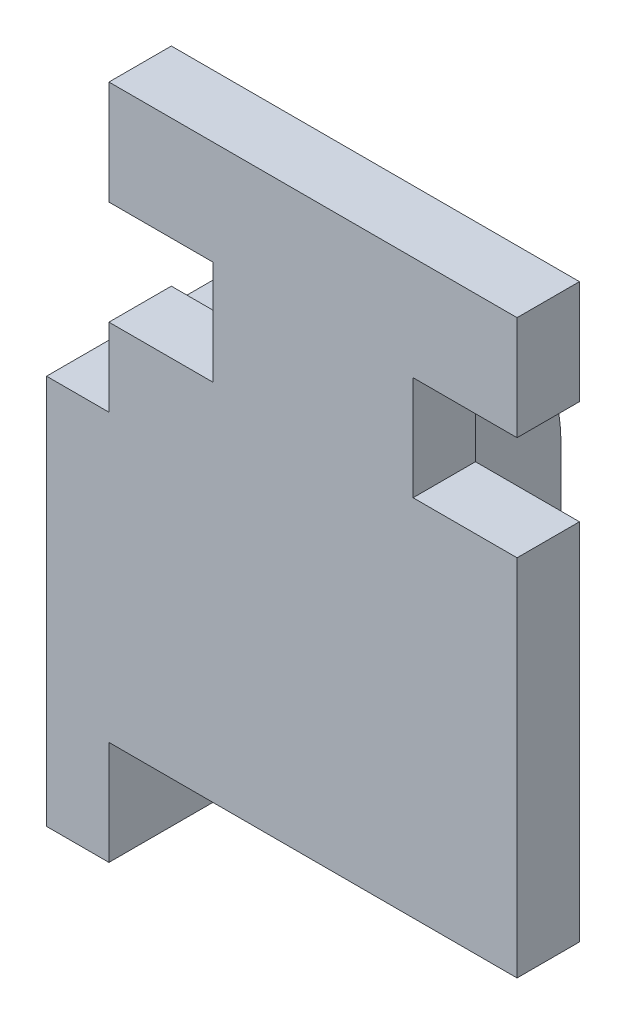
ISO-10303-21;
HEADER;
FILE_DESCRIPTION(('STEP AP214'),'2;1');
FILE_NAME('part.step','',(''),(''),'','','');
FILE_SCHEMA(('AUTOMOTIVE_DESIGN { 1 0 10303 214 1 1 1 1 }'));
ENDSEC;
DATA;
#1=APPLICATION_CONTEXT('core data for automotive mechanical design processes');
#2=APPLICATION_PROTOCOL_DEFINITION('international standard','automotive_design',2000,#1);
#3=PRODUCT_CONTEXT('',#1,'mechanical');
#4=PRODUCT('Part','Part','',(#3));
#5=PRODUCT_RELATED_PRODUCT_CATEGORY('part','',(#4));
#6=PRODUCT_DEFINITION_FORMATION('','',#4);
#7=PRODUCT_DEFINITION_CONTEXT('part definition',#1,'design');
#8=PRODUCT_DEFINITION('design','',#6,#7);
#9=PRODUCT_DEFINITION_SHAPE('','',#8);
#10=(LENGTH_UNIT() NAMED_UNIT(*) SI_UNIT(.MILLI.,.METRE.));
#11=(NAMED_UNIT(*) PLANE_ANGLE_UNIT() SI_UNIT($,.RADIAN.));
#12=(NAMED_UNIT(*) SI_UNIT($,.STERADIAN.) SOLID_ANGLE_UNIT());
#13=UNCERTAINTY_MEASURE_WITH_UNIT(LENGTH_MEASURE(1.E-05),#10,'distance_accuracy_value','');
#14=(GEOMETRIC_REPRESENTATION_CONTEXT(3) GLOBAL_UNCERTAINTY_ASSIGNED_CONTEXT((#13)) GLOBAL_UNIT_ASSIGNED_CONTEXT((#10,
#11,#12)) REPRESENTATION_CONTEXT('',''));
#15=CARTESIAN_POINT('',(0.,0.,0.));
#16=DIRECTION('',(0.,0.,1.));
#17=DIRECTION('',(1.,0.,0.));
#18=AXIS2_PLACEMENT_3D('',#15,#16,#17);
#19=CARTESIAN_POINT('',(0.,0.,0.24));
#20=DIRECTION('',(1.,0.,0.));
#21=DIRECTION('',(0.,0.,-1.));
#22=AXIS2_PLACEMENT_3D('',#19,#20,#21);
#23=PLANE('',#22);
#24=DIRECTION('',(0.,0.,-1.));
#25=VECTOR('',#24,1.);
#26=CARTESIAN_POINT('',(0.,1.1,-1.5));
#27=LINE('',#26,#25);
#28=CARTESIAN_POINT('',(0.,1.1,0.24));
#29=VERTEX_POINT('',#28);
#30=CARTESIAN_POINT('',(0.,1.1,0.));
#31=VERTEX_POINT('',#30);
#32=EDGE_CURVE('E335',#29,#31,#27,.T.);
#33=ORIENTED_EDGE('',*,*,#32,.F.);
#34=DIRECTION('',(0.,-1.,0.));
#35=VECTOR('',#34,1.);
#36=CARTESIAN_POINT('',(0.,0.,0.24));
#37=LINE('',#36,#35);
#38=CARTESIAN_POINT('',(0.,1.4,0.24));
#39=VERTEX_POINT('',#38);
#40=EDGE_CURVE('E185',#39,#29,#37,.T.);
#41=ORIENTED_EDGE('',*,*,#40,.F.);
#42=DIRECTION('',(0.,0.,-1.));
#43=VECTOR('',#42,1.);
#44=CARTESIAN_POINT('',(0.,1.4,0.24));
#45=LINE('',#44,#43);
#46=CARTESIAN_POINT('',(0.,1.4,0.));
#47=VERTEX_POINT('',#46);
#48=EDGE_CURVE('E273',#39,#47,#45,.T.);
#49=ORIENTED_EDGE('',*,*,#48,.T.);
#50=DIRECTION('',(0.,-1.,0.));
#51=VECTOR('',#50,1.);
#52=CARTESIAN_POINT('',(0.,0.,0.));
#53=LINE('',#52,#51);
#54=EDGE_CURVE('E204',#47,#31,#53,.T.);
#55=ORIENTED_EDGE('',*,*,#54,.T.);
#56=EDGE_LOOP('',(#33,#41,#49,#55));
#57=FACE_BOUND('',#56,.T.);
#58=ADVANCED_FACE('F39',(#57),#23,.F.);
#59=CARTESIAN_POINT('',(1.57,0.,0.24));
#60=DIRECTION('',(0.,1.,0.));
#61=DIRECTION('',(-1.,0.,0.));
#62=AXIS2_PLACEMENT_3D('',#59,#60,#61);
#63=PLANE('',#62);
#64=DIRECTION('',(1.,0.,0.));
#65=VECTOR('',#64,1.);
#66=CARTESIAN_POINT('',(1.57,0.,0.));
#67=LINE('',#66,#65);
#68=CARTESIAN_POINT('',(0.,0.,0.));
#69=VERTEX_POINT('',#68);
#70=CARTESIAN_POINT('',(1.57,0.,0.));
#71=VERTEX_POINT('',#70);
#72=EDGE_CURVE('E187',#69,#71,#67,.T.);
#73=ORIENTED_EDGE('',*,*,#72,.T.);
#74=DIRECTION('',(0.,0.,-1.));
#75=VECTOR('',#74,1.);
#76=CARTESIAN_POINT('',(1.57,0.,0.24));
#77=LINE('',#76,#75);
#78=CARTESIAN_POINT('',(1.57,0.,0.24));
#79=VERTEX_POINT('',#78);
#80=EDGE_CURVE('E313',#79,#71,#77,.T.);
#81=ORIENTED_EDGE('',*,*,#80,.F.);
#82=DIRECTION('',(1.,0.,0.));
#83=VECTOR('',#82,1.);
#84=CARTESIAN_POINT('',(1.57,0.,0.24));
#85=LINE('',#84,#83);
#86=CARTESIAN_POINT('',(0.,0.,0.24));
#87=VERTEX_POINT('',#86);
#88=EDGE_CURVE('E200',#87,#79,#85,.T.);
#89=ORIENTED_EDGE('',*,*,#88,.F.);
#90=DIRECTION('',(0.,0.,-1.));
#91=VECTOR('',#90,1.);
#92=CARTESIAN_POINT('',(0.,0.,0.24));
#93=LINE('',#92,#91);
#94=EDGE_CURVE('E235',#87,#69,#93,.T.);
#95=ORIENTED_EDGE('',*,*,#94,.T.);
#96=EDGE_LOOP('',(#73,#81,#89,#95));
#97=FACE_BOUND('',#96,.T.);
#98=ADVANCED_FACE('F385',(#97),#63,.F.);
#99=CARTESIAN_POINT('',(1.57,1.4,0.24));
#100=DIRECTION('',(-1.,0.,0.));
#101=DIRECTION('',(0.,0.,1.));
#102=AXIS2_PLACEMENT_3D('',#99,#100,#101);
#103=PLANE('',#102);
#104=DIRECTION('',(0.,1.,0.));
#105=VECTOR('',#104,1.);
#106=CARTESIAN_POINT('',(1.57,1.4,0.));
#107=LINE('',#106,#105);
#108=CARTESIAN_POINT('',(1.57,1.4,0.));
#109=VERTEX_POINT('',#108);
#110=EDGE_CURVE('E193',#71,#109,#107,.T.);
#111=ORIENTED_EDGE('',*,*,#110,.T.);
#112=DIRECTION('',(0.,0.,-1.));
#113=VECTOR('',#112,1.);
#114=CARTESIAN_POINT('',(1.57,1.4,0.24));
#115=LINE('',#114,#113);
#116=CARTESIAN_POINT('',(1.57,1.4,0.24));
#117=VERTEX_POINT('',#116);
#118=EDGE_CURVE('E309',#117,#109,#115,.T.);
#119=ORIENTED_EDGE('',*,*,#118,.F.);
#120=DIRECTION('',(0.,1.,0.));
#121=VECTOR('',#120,1.);
#122=CARTESIAN_POINT('',(1.57,1.4,0.24));
#123=LINE('',#122,#121);
#124=EDGE_CURVE('E203',#79,#117,#123,.T.);
#125=ORIENTED_EDGE('',*,*,#124,.F.);
#126=ORIENTED_EDGE('',*,*,#80,.T.);
#127=EDGE_LOOP('',(#111,#119,#125,#126));
#128=FACE_BOUND('',#127,.T.);
#129=ADVANCED_FACE('F382',(#128),#103,.F.);
#130=CARTESIAN_POINT('',(1.17,1.4,0.24));
#131=DIRECTION('',(0.,-1.,0.));
#132=DIRECTION('',(1.,0.,0.));
#133=AXIS2_PLACEMENT_3D('',#130,#131,#132);
#134=PLANE('',#133);
#135=DIRECTION('',(-1.,0.,0.));
#136=VECTOR('',#135,1.);
#137=CARTESIAN_POINT('',(1.17,1.4,0.));
#138=LINE('',#137,#136);
#139=CARTESIAN_POINT('',(1.17,1.4,0.));
#140=VERTEX_POINT('',#139);
#141=EDGE_CURVE('E239',#109,#140,#138,.T.);
#142=ORIENTED_EDGE('',*,*,#141,.T.);
#143=DIRECTION('',(0.,0.,-1.));
#144=VECTOR('',#143,1.);
#145=CARTESIAN_POINT('',(1.17,1.4,0.24));
#146=LINE('',#145,#144);
#147=CARTESIAN_POINT('',(1.17,1.4,0.24));
#148=VERTEX_POINT('',#147);
#149=EDGE_CURVE('E305',#148,#140,#146,.T.);
#150=ORIENTED_EDGE('',*,*,#149,.F.);
#151=DIRECTION('',(-1.,0.,0.));
#152=VECTOR('',#151,1.);
#153=CARTESIAN_POINT('',(1.17,1.4,0.24));
#154=LINE('',#153,#152);
#155=EDGE_CURVE('E207',#117,#148,#154,.T.);
#156=ORIENTED_EDGE('',*,*,#155,.F.);
#157=ORIENTED_EDGE('',*,*,#118,.T.);
#158=EDGE_LOOP('',(#142,#150,#156,#157));
#159=FACE_BOUND('',#158,.T.);
#160=ADVANCED_FACE('F379',(#159),#134,.F.);
#161=CARTESIAN_POINT('',(1.17,1.8,0.24));
#162=DIRECTION('',(-1.,0.,0.));
#163=DIRECTION('',(0.,0.,1.));
#164=AXIS2_PLACEMENT_3D('',#161,#162,#163);
#165=PLANE('',#164);
#166=DIRECTION('',(0.,1.,0.));
#167=VECTOR('',#166,1.);
#168=CARTESIAN_POINT('',(1.17,1.8,0.));
#169=LINE('',#168,#167);
#170=CARTESIAN_POINT('',(1.17,1.8,0.));
#171=VERTEX_POINT('',#170);
#172=EDGE_CURVE('E242',#140,#171,#169,.T.);
#173=ORIENTED_EDGE('',*,*,#172,.T.);
#174=DIRECTION('',(0.,0.,-1.));
#175=VECTOR('',#174,1.);
#176=CARTESIAN_POINT('',(1.17,1.8,0.24));
#177=LINE('',#176,#175);
#178=CARTESIAN_POINT('',(1.17,1.8,0.24));
#179=VERTEX_POINT('',#178);
#180=EDGE_CURVE('E301',#179,#171,#177,.T.);
#181=ORIENTED_EDGE('',*,*,#180,.F.);
#182=DIRECTION('',(0.,1.,0.));
#183=VECTOR('',#182,1.);
#184=CARTESIAN_POINT('',(1.17,1.8,0.24));
#185=LINE('',#184,#183);
#186=EDGE_CURVE('E210',#148,#179,#185,.T.);
#187=ORIENTED_EDGE('',*,*,#186,.F.);
#188=ORIENTED_EDGE('',*,*,#149,.T.);
#189=EDGE_LOOP('',(#173,#181,#187,#188));
#190=FACE_BOUND('',#189,.T.);
#191=ADVANCED_FACE('F374',(#190),#165,.F.);
#192=CARTESIAN_POINT('',(1.57,1.8,0.24));
#193=DIRECTION('',(0.,1.,0.));
#194=DIRECTION('',(0.,0.,1.));
#195=AXIS2_PLACEMENT_3D('',#192,#193,#194);
#196=PLANE('',#195);
#197=DIRECTION('',(1.,0.,0.));
#198=VECTOR('',#197,1.);
#199=CARTESIAN_POINT('',(1.57,1.8,0.));
#200=LINE('',#199,#198);
#201=CARTESIAN_POINT('',(1.57,1.8,0.));
#202=VERTEX_POINT('',#201);
#203=EDGE_CURVE('E245',#171,#202,#200,.T.);
#204=ORIENTED_EDGE('',*,*,#203,.T.);
#205=DIRECTION('',(0.,0.,-1.));
#206=VECTOR('',#205,1.);
#207=CARTESIAN_POINT('',(1.57,1.8,0.24));
#208=LINE('',#207,#206);
#209=CARTESIAN_POINT('',(1.57,1.8,0.24));
#210=VERTEX_POINT('',#209);
#211=EDGE_CURVE('E297',#210,#202,#208,.T.);
#212=ORIENTED_EDGE('',*,*,#211,.F.);
#213=DIRECTION('',(1.,0.,0.));
#214=VECTOR('',#213,1.);
#215=CARTESIAN_POINT('',(1.57,1.8,0.24));
#216=LINE('',#215,#214);
#217=EDGE_CURVE('E213',#179,#210,#216,.T.);
#218=ORIENTED_EDGE('',*,*,#217,.F.);
#219=ORIENTED_EDGE('',*,*,#180,.T.);
#220=EDGE_LOOP('',(#204,#212,#218,#219));
#221=FACE_BOUND('',#220,.T.);
#222=ADVANCED_FACE('F369',(#221),#196,.F.);
#223=CARTESIAN_POINT('',(1.57,2.2,0.24));
#224=DIRECTION('',(-1.,0.,0.));
#225=DIRECTION('',(0.,0.,1.));
#226=AXIS2_PLACEMENT_3D('',#223,#224,#225);
#227=PLANE('',#226);
#228=DIRECTION('',(0.,1.,0.));
#229=VECTOR('',#228,1.);
#230=CARTESIAN_POINT('',(1.57,2.2,0.));
#231=LINE('',#230,#229);
#232=CARTESIAN_POINT('',(1.57,2.2,0.));
#233=VERTEX_POINT('',#232);
#234=EDGE_CURVE('E248',#202,#233,#231,.T.);
#235=ORIENTED_EDGE('',*,*,#234,.T.);
#236=DIRECTION('',(0.,0.,-1.));
#237=VECTOR('',#236,1.);
#238=CARTESIAN_POINT('',(1.57,2.2,0.24));
#239=LINE('',#238,#237);
#240=CARTESIAN_POINT('',(1.57,2.2,0.24));
#241=VERTEX_POINT('',#240);
#242=EDGE_CURVE('E293',#241,#233,#239,.T.);
#243=ORIENTED_EDGE('',*,*,#242,.F.);
#244=DIRECTION('',(0.,1.,0.));
#245=VECTOR('',#244,1.);
#246=CARTESIAN_POINT('',(1.57,2.2,0.24));
#247=LINE('',#246,#245);
#248=EDGE_CURVE('E216',#210,#241,#247,.T.);
#249=ORIENTED_EDGE('',*,*,#248,.F.);
#250=ORIENTED_EDGE('',*,*,#211,.T.);
#251=EDGE_LOOP('',(#235,#243,#249,#250));
#252=FACE_BOUND('',#251,.T.);
#253=ADVANCED_FACE('F365',(#252),#227,.F.);
#254=CARTESIAN_POINT('',(0.,2.2,0.24));
#255=DIRECTION('',(0.,-1.,0.));
#256=DIRECTION('',(0.,0.,-1.));
#257=AXIS2_PLACEMENT_3D('',#254,#255,#256);
#258=PLANE('',#257);
#259=DIRECTION('',(-1.,0.,0.));
#260=VECTOR('',#259,1.);
#261=CARTESIAN_POINT('',(0.,2.2,0.));
#262=LINE('',#261,#260);
#263=CARTESIAN_POINT('',(0.,2.2,0.));
#264=VERTEX_POINT('',#263);
#265=EDGE_CURVE('E251',#233,#264,#262,.T.);
#266=ORIENTED_EDGE('',*,*,#265,.T.);
#267=DIRECTION('',(0.,0.,-1.));
#268=VECTOR('',#267,1.);
#269=CARTESIAN_POINT('',(0.,2.2,0.24));
#270=LINE('',#269,#268);
#271=CARTESIAN_POINT('',(0.,2.2,0.24));
#272=VERTEX_POINT('',#271);
#273=EDGE_CURVE('E289',#272,#264,#270,.T.);
#274=ORIENTED_EDGE('',*,*,#273,.F.);
#275=DIRECTION('',(-1.,0.,0.));
#276=VECTOR('',#275,1.);
#277=CARTESIAN_POINT('',(0.,2.2,0.24));
#278=LINE('',#277,#276);
#279=EDGE_CURVE('E219',#241,#272,#278,.T.);
#280=ORIENTED_EDGE('',*,*,#279,.F.);
#281=ORIENTED_EDGE('',*,*,#242,.T.);
#282=EDGE_LOOP('',(#266,#274,#280,#281));
#283=FACE_BOUND('',#282,.T.);
#284=ADVANCED_FACE('F360',(#283),#258,.F.);
#285=CARTESIAN_POINT('',(0.,1.8,0.24));
#286=DIRECTION('',(1.,0.,0.));
#287=DIRECTION('',(0.,0.,-1.));
#288=AXIS2_PLACEMENT_3D('',#285,#286,#287);
#289=PLANE('',#288);
#290=DIRECTION('',(0.,-1.,0.));
#291=VECTOR('',#290,1.);
#292=CARTESIAN_POINT('',(0.,1.8,0.));
#293=LINE('',#292,#291);
#294=CARTESIAN_POINT('',(0.,1.8,0.));
#295=VERTEX_POINT('',#294);
#296=EDGE_CURVE('E254',#264,#295,#293,.T.);
#297=ORIENTED_EDGE('',*,*,#296,.T.);
#298=DIRECTION('',(0.,0.,-1.));
#299=VECTOR('',#298,1.);
#300=CARTESIAN_POINT('',(0.,1.8,0.24));
#301=LINE('',#300,#299);
#302=CARTESIAN_POINT('',(0.,1.8,0.24));
#303=VERTEX_POINT('',#302);
#304=EDGE_CURVE('E285',#303,#295,#301,.T.);
#305=ORIENTED_EDGE('',*,*,#304,.F.);
#306=DIRECTION('',(0.,-1.,0.));
#307=VECTOR('',#306,1.);
#308=CARTESIAN_POINT('',(0.,1.8,0.24));
#309=LINE('',#308,#307);
#310=EDGE_CURVE('E222',#272,#303,#309,.T.);
#311=ORIENTED_EDGE('',*,*,#310,.F.);
#312=ORIENTED_EDGE('',*,*,#273,.T.);
#313=EDGE_LOOP('',(#297,#305,#311,#312));
#314=FACE_BOUND('',#313,.T.);
#315=ADVANCED_FACE('F354',(#314),#289,.F.);
#316=CARTESIAN_POINT('',(0.4,1.8,0.24));
#317=DIRECTION('',(0.,1.,0.));
#318=DIRECTION('',(0.,0.,1.));
#319=AXIS2_PLACEMENT_3D('',#316,#317,#318);
#320=PLANE('',#319);
#321=DIRECTION('',(1.,0.,0.));
#322=VECTOR('',#321,1.);
#323=CARTESIAN_POINT('',(0.4,1.8,0.));
#324=LINE('',#323,#322);
#325=CARTESIAN_POINT('',(0.4,1.8,0.));
#326=VERTEX_POINT('',#325);
#327=EDGE_CURVE('E257',#295,#326,#324,.T.);
#328=ORIENTED_EDGE('',*,*,#327,.T.);
#329=DIRECTION('',(0.,0.,-1.));
#330=VECTOR('',#329,1.);
#331=CARTESIAN_POINT('',(0.4,1.8,0.24));
#332=LINE('',#331,#330);
#333=CARTESIAN_POINT('',(0.4,1.8,0.24));
#334=VERTEX_POINT('',#333);
#335=EDGE_CURVE('E281',#334,#326,#332,.T.);
#336=ORIENTED_EDGE('',*,*,#335,.F.);
#337=DIRECTION('',(1.,0.,0.));
#338=VECTOR('',#337,1.);
#339=CARTESIAN_POINT('',(0.4,1.8,0.24));
#340=LINE('',#339,#338);
#341=EDGE_CURVE('E225',#303,#334,#340,.T.);
#342=ORIENTED_EDGE('',*,*,#341,.F.);
#343=ORIENTED_EDGE('',*,*,#304,.T.);
#344=EDGE_LOOP('',(#328,#336,#342,#343));
#345=FACE_BOUND('',#344,.T.);
#346=ADVANCED_FACE('F350',(#345),#320,.F.);
#347=CARTESIAN_POINT('',(0.4,1.4,0.24));
#348=DIRECTION('',(1.,0.,0.));
#349=DIRECTION('',(0.,1.,0.));
#350=AXIS2_PLACEMENT_3D('',#347,#348,#349);
#351=PLANE('',#350);
#352=DIRECTION('',(0.,-1.,0.));
#353=VECTOR('',#352,1.);
#354=CARTESIAN_POINT('',(0.4,1.4,0.));
#355=LINE('',#354,#353);
#356=CARTESIAN_POINT('',(0.4,1.4,0.));
#357=VERTEX_POINT('',#356);
#358=EDGE_CURVE('E260',#326,#357,#355,.T.);
#359=ORIENTED_EDGE('',*,*,#358,.T.);
#360=DIRECTION('',(0.,0.,-1.));
#361=VECTOR('',#360,1.);
#362=CARTESIAN_POINT('',(0.4,1.4,0.24));
#363=LINE('',#362,#361);
#364=CARTESIAN_POINT('',(0.4,1.4,0.24));
#365=VERTEX_POINT('',#364);
#366=EDGE_CURVE('E277',#365,#357,#363,.T.);
#367=ORIENTED_EDGE('',*,*,#366,.F.);
#368=DIRECTION('',(0.,-1.,0.));
#369=VECTOR('',#368,1.);
#370=CARTESIAN_POINT('',(0.4,1.4,0.24));
#371=LINE('',#370,#369);
#372=EDGE_CURVE('E228',#334,#365,#371,.T.);
#373=ORIENTED_EDGE('',*,*,#372,.F.);
#374=ORIENTED_EDGE('',*,*,#335,.T.);
#375=EDGE_LOOP('',(#359,#367,#373,#374));
#376=FACE_BOUND('',#375,.T.);
#377=ADVANCED_FACE('F345',(#376),#351,.F.);
#378=CARTESIAN_POINT('',(0.,1.4,0.24));
#379=DIRECTION('',(0.,-1.,0.));
#380=DIRECTION('',(0.,0.,-1.));
#381=AXIS2_PLACEMENT_3D('',#378,#379,#380);
#382=PLANE('',#381);
#383=DIRECTION('',(-1.,0.,0.));
#384=VECTOR('',#383,1.);
#385=CARTESIAN_POINT('',(0.,1.4,0.));
#386=LINE('',#385,#384);
#387=EDGE_CURVE('E263',#357,#47,#386,.T.);
#388=ORIENTED_EDGE('',*,*,#387,.T.);
#389=ORIENTED_EDGE('',*,*,#48,.F.);
#390=DIRECTION('',(-1.,0.,0.));
#391=VECTOR('',#390,1.);
#392=CARTESIAN_POINT('',(0.,1.4,0.24));
#393=LINE('',#392,#391);
#394=EDGE_CURVE('E231',#365,#39,#393,.T.);
#395=ORIENTED_EDGE('',*,*,#394,.F.);
#396=ORIENTED_EDGE('',*,*,#366,.T.);
#397=EDGE_LOOP('',(#388,#389,#395,#396));
#398=FACE_BOUND('',#397,.T.);
#399=ADVANCED_FACE('F339',(#398),#382,.F.);
#400=CARTESIAN_POINT('',(0.,0.,0.24));
#401=DIRECTION('',(0.,0.,-1.));
#402=DIRECTION('',(-1.,0.,0.));
#403=AXIS2_PLACEMENT_3D('',#400,#401,#402);
#404=PLANE('',#403);
#405=ORIENTED_EDGE('',*,*,#88,.T.);
#406=ORIENTED_EDGE('',*,*,#124,.T.);
#407=ORIENTED_EDGE('',*,*,#155,.T.);
#408=ORIENTED_EDGE('',*,*,#186,.T.);
#409=ORIENTED_EDGE('',*,*,#217,.T.);
#410=ORIENTED_EDGE('',*,*,#248,.T.);
#411=ORIENTED_EDGE('',*,*,#279,.T.);
#412=ORIENTED_EDGE('',*,*,#310,.T.);
#413=ORIENTED_EDGE('',*,*,#341,.T.);
#414=ORIENTED_EDGE('',*,*,#372,.T.);
#415=ORIENTED_EDGE('',*,*,#394,.T.);
#416=ORIENTED_EDGE('',*,*,#40,.T.);
#417=DIRECTION('',(1.,0.,0.));
#418=VECTOR('',#417,1.);
#419=CARTESIAN_POINT('',(-0.24,1.1,0.24));
#420=LINE('',#419,#418);
#421=CARTESIAN_POINT('',(-0.24,1.1,0.24));
#422=VERTEX_POINT('',#421);
#423=EDGE_CURVE('E164',#422,#29,#420,.T.);
#424=ORIENTED_EDGE('',*,*,#423,.F.);
#425=DIRECTION('',(0.,1.,0.));
#426=VECTOR('',#425,1.);
#427=CARTESIAN_POINT('',(-0.24,1.1,0.24));
#428=LINE('',#427,#426);
#429=CARTESIAN_POINT('',(-0.24,-0.4,0.24));
#430=VERTEX_POINT('',#429);
#431=EDGE_CURVE('E169',#430,#422,#428,.T.);
#432=ORIENTED_EDGE('',*,*,#431,.F.);
#433=DIRECTION('',(1.,0.,0.));
#434=VECTOR('',#433,1.);
#435=CARTESIAN_POINT('',(-0.24,-0.4,0.24));
#436=LINE('',#435,#434);
#437=CARTESIAN_POINT('',(0.,-0.4,0.24));
#438=VERTEX_POINT('',#437);
#439=EDGE_CURVE('E196',#430,#438,#436,.T.);
#440=ORIENTED_EDGE('',*,*,#439,.T.);
#441=DIRECTION('',(0.,1.,0.));
#442=VECTOR('',#441,1.);
#443=CARTESIAN_POINT('',(0.,0.,0.24));
#444=LINE('',#443,#442);
#445=EDGE_CURVE('E179',#438,#87,#444,.T.);
#446=ORIENTED_EDGE('',*,*,#445,.T.);
#447=EDGE_LOOP('',(#405,#406,#407,#408,#409,#410,#411,#412,#413,#414,#415,#416,#424,#432,#440,#446));
#448=FACE_BOUND('',#447,.T.);
#449=ADVANCED_FACE('F183',(#448),#404,.F.);
#450=CARTESIAN_POINT('',(0.,0.,0.));
#451=DIRECTION('',(0.,0.,-1.));
#452=DIRECTION('',(-1.,0.,0.));
#453=AXIS2_PLACEMENT_3D('',#450,#451,#452);
#454=PLANE('',#453);
#455=ORIENTED_EDGE('',*,*,#72,.F.);
#456=EDGE_CURVE('E266',#31,#69,#53,.T.);
#457=ORIENTED_EDGE('',*,*,#456,.F.);
#458=ORIENTED_EDGE('',*,*,#54,.F.);
#459=ORIENTED_EDGE('',*,*,#387,.F.);
#460=ORIENTED_EDGE('',*,*,#358,.F.);
#461=ORIENTED_EDGE('',*,*,#327,.F.);
#462=ORIENTED_EDGE('',*,*,#296,.F.);
#463=ORIENTED_EDGE('',*,*,#265,.F.);
#464=ORIENTED_EDGE('',*,*,#234,.F.);
#465=ORIENTED_EDGE('',*,*,#203,.F.);
#466=ORIENTED_EDGE('',*,*,#172,.F.);
#467=ORIENTED_EDGE('',*,*,#141,.F.);
#468=ORIENTED_EDGE('',*,*,#110,.F.);
#469=EDGE_LOOP('',(#455,#457,#458,#459,#460,#461,#462,#463,#464,#465,#466,#467,#468));
#470=FACE_BOUND('',#469,.T.);
#471=ADVANCED_FACE('F332',(#470),#454,.T.);
#472=CARTESIAN_POINT('',(0.,0.,0.));
#473=DIRECTION('',(-1.,0.,0.));
#474=DIRECTION('',(0.,0.,1.));
#475=AXIS2_PLACEMENT_3D('',#472,#473,#474);
#476=PLANE('',#475);
#477=DIRECTION('',(0.,-1.,0.));
#478=VECTOR('',#477,1.);
#479=CARTESIAN_POINT('',(0.,-0.4,-1.5));
#480=LINE('',#479,#478);
#481=CARTESIAN_POINT('',(0.,0.0999999999999995,-1.5));
#482=VERTEX_POINT('',#481);
#483=CARTESIAN_POINT('',(0.,-0.4,-1.5));
#484=VERTEX_POINT('',#483);
#485=EDGE_CURVE('E391',#482,#484,#480,.T.);
#486=ORIENTED_EDGE('',*,*,#485,.F.);
#487=CARTESIAN_POINT('',(0.,0.0999999999999999,-0.5));
#488=DIRECTION('',(-1.,0.,0.));
#489=DIRECTION('',(0.,0.,1.));
#490=AXIS2_PLACEMENT_3D('',#487,#488,#489);
#491=CIRCLE('',#490,1.);
#492=CARTESIAN_POINT('',(0.,1.1,-0.5));
#493=VERTEX_POINT('',#492);
#494=EDGE_CURVE('E62',#482,#493,#491,.F.);
#495=ORIENTED_EDGE('',*,*,#494,.T.);
#496=EDGE_CURVE('E329',#31,#493,#27,.T.);
#497=ORIENTED_EDGE('',*,*,#496,.F.);
#498=ORIENTED_EDGE('',*,*,#456,.T.);
#499=ORIENTED_EDGE('',*,*,#94,.F.);
#500=ORIENTED_EDGE('',*,*,#445,.F.);
#501=DIRECTION('',(0.,0.,1.));
#502=VECTOR('',#501,1.);
#503=CARTESIAN_POINT('',(0.,-0.4,-1.5));
#504=LINE('',#503,#502);
#505=EDGE_CURVE('E388',#484,#438,#504,.T.);
#506=ORIENTED_EDGE('',*,*,#505,.F.);
#507=EDGE_LOOP('',(#486,#495,#497,#498,#499,#500,#506));
#508=FACE_BOUND('',#507,.T.);
#509=ADVANCED_FACE('F326',(#508),#476,.F.);
#510=CARTESIAN_POINT('',(-0.24,1.1,-1.5));
#511=DIRECTION('',(0.,-1.,0.));
#512=DIRECTION('',(0.,0.,-1.));
#513=AXIS2_PLACEMENT_3D('',#510,#511,#512);
#514=PLANE('',#513);
#515=ORIENTED_EDGE('',*,*,#496,.T.);
#516=DIRECTION('',(1.,0.,0.));
#517=VECTOR('',#516,1.);
#518=CARTESIAN_POINT('',(-0.24,1.1,-0.5));
#519=LINE('',#518,#517);
#520=CARTESIAN_POINT('',(-0.24,1.1,-0.5));
#521=VERTEX_POINT('',#520);
#522=EDGE_CURVE('E48',#493,#521,#519,.F.);
#523=ORIENTED_EDGE('',*,*,#522,.T.);
#524=DIRECTION('',(0.,0.,-1.));
#525=VECTOR('',#524,1.);
#526=CARTESIAN_POINT('',(-0.24,1.1,0.));
#527=LINE('',#526,#525);
#528=EDGE_CURVE('E159',#422,#521,#527,.T.);
#529=ORIENTED_EDGE('',*,*,#528,.F.);
#530=ORIENTED_EDGE('',*,*,#423,.T.);
#531=ORIENTED_EDGE('',*,*,#32,.T.);
#532=EDGE_LOOP('',(#515,#523,#529,#530,#531));
#533=FACE_BOUND('',#532,.T.);
#534=ADVANCED_FACE('F161',(#533),#514,.F.);
#535=CARTESIAN_POINT('',(-0.24,-0.4,-1.5));
#536=DIRECTION('',(0.,0.,1.));
#537=DIRECTION('',(0.,-1.,0.));
#538=AXIS2_PLACEMENT_3D('',#535,#536,#537);
#539=PLANE('',#538);
#540=DIRECTION('',(0.,-1.,0.));
#541=VECTOR('',#540,1.);
#542=CARTESIAN_POINT('',(-0.24,-0.4,-1.5));
#543=LINE('',#542,#541);
#544=CARTESIAN_POINT('',(-0.24,0.0999999999999995,-1.5));
#545=VERTEX_POINT('',#544);
#546=CARTESIAN_POINT('',(-0.24,-0.4,-1.5));
#547=VERTEX_POINT('',#546);
#548=EDGE_CURVE('E168',#545,#547,#543,.T.);
#549=ORIENTED_EDGE('',*,*,#548,.F.);
#550=DIRECTION('',(1.,0.,0.));
#551=VECTOR('',#550,1.);
#552=CARTESIAN_POINT('',(-0.24,0.0999999999999995,-1.5));
#553=LINE('',#552,#551);
#554=EDGE_CURVE('E317',#545,#482,#553,.T.);
#555=ORIENTED_EDGE('',*,*,#554,.T.);
#556=ORIENTED_EDGE('',*,*,#485,.T.);
#557=DIRECTION('',(1.,0.,0.));
#558=VECTOR('',#557,1.);
#559=CARTESIAN_POINT('',(-0.24,-0.4,-1.5));
#560=LINE('',#559,#558);
#561=EDGE_CURVE('E188',#547,#484,#560,.T.);
#562=ORIENTED_EDGE('',*,*,#561,.F.);
#563=EDGE_LOOP('',(#549,#555,#556,#562));
#564=FACE_BOUND('',#563,.T.);
#565=ADVANCED_FACE('F405',(#564),#539,.F.);
#566=CARTESIAN_POINT('',(-0.24,-0.4,-1.5));
#567=DIRECTION('',(0.,1.,0.));
#568=DIRECTION('',(0.,0.,1.));
#569=AXIS2_PLACEMENT_3D('',#566,#567,#568);
#570=PLANE('',#569);
#571=ORIENTED_EDGE('',*,*,#505,.T.);
#572=ORIENTED_EDGE('',*,*,#439,.F.);
#573=DIRECTION('',(0.,0.,1.));
#574=VECTOR('',#573,1.);
#575=CARTESIAN_POINT('',(-0.24,-0.4,-1.5));
#576=LINE('',#575,#574);
#577=EDGE_CURVE('E174',#547,#430,#576,.T.);
#578=ORIENTED_EDGE('',*,*,#577,.F.);
#579=ORIENTED_EDGE('',*,*,#561,.T.);
#580=EDGE_LOOP('',(#571,#572,#578,#579));
#581=FACE_BOUND('',#580,.T.);
#582=ADVANCED_FACE('F408',(#581),#570,.F.);
#583=CARTESIAN_POINT('',(-0.24,0.,0.));
#584=DIRECTION('',(-1.,0.,0.));
#585=DIRECTION('',(0.,0.,1.));
#586=AXIS2_PLACEMENT_3D('',#583,#584,#585);
#587=PLANE('',#586);
#588=ORIENTED_EDGE('',*,*,#528,.T.);
#589=CARTESIAN_POINT('',(-0.24,0.0999999999999999,-0.5));
#590=DIRECTION('',(-1.,0.,0.));
#591=DIRECTION('',(0.,0.,1.));
#592=AXIS2_PLACEMENT_3D('',#589,#590,#591);
#593=CIRCLE('',#592,1.);
#594=EDGE_CURVE('E11',#521,#545,#593,.T.);
#595=ORIENTED_EDGE('',*,*,#594,.T.);
#596=ORIENTED_EDGE('',*,*,#548,.T.);
#597=ORIENTED_EDGE('',*,*,#577,.T.);
#598=ORIENTED_EDGE('',*,*,#431,.T.);
#599=EDGE_LOOP('',(#588,#595,#596,#597,#598));
#600=FACE_BOUND('',#599,.T.);
#601=ADVANCED_FACE('F172',(#600),#587,.T.);
#602=CARTESIAN_POINT('',(-0.24,0.0999999999999999,-0.5));
#603=DIRECTION('',(1.,0.,0.));
#604=DIRECTION('',(0.,0.,-1.));
#605=AXIS2_PLACEMENT_3D('',#602,#603,#604);
#606=CYLINDRICAL_SURFACE('',#605,1.);
#607=ORIENTED_EDGE('',*,*,#594,.F.);
#608=ORIENTED_EDGE('',*,*,#522,.F.);
#609=ORIENTED_EDGE('',*,*,#494,.F.);
#610=ORIENTED_EDGE('',*,*,#554,.F.);
#611=EDGE_LOOP('',(#607,#608,#609,#610));
#612=FACE_BOUND('',#611,.T.);
#613=ADVANCED_FACE('F41',(#612),#606,.T.);
#614=CLOSED_SHELL('',(#58,#98,#129,#160,#191,#222,#253,#284,#315,#346,#377,#399,#449,#471,#509,
#534,#565,#582,#601,#613));
#615=MANIFOLD_SOLID_BREP('B2',#614);
#616=ADVANCED_BREP_SHAPE_REPRESENTATION('',(#18,#615),#14);
#617=SHAPE_DEFINITION_REPRESENTATION(#9,#616);
ENDSEC;
END-ISO-10303-21;
